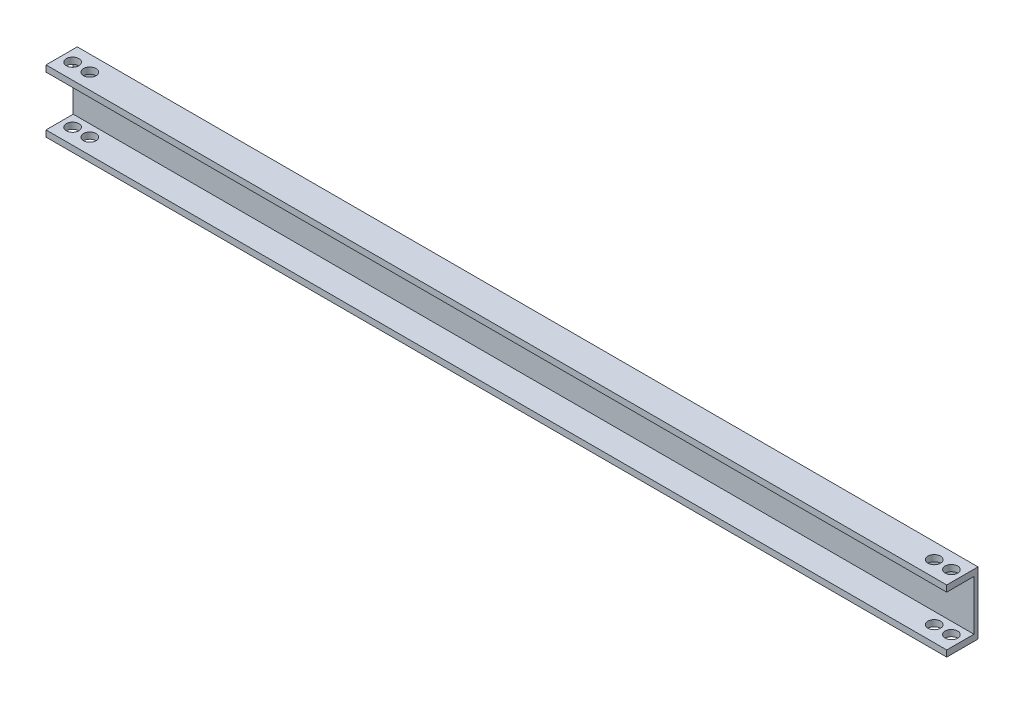
ISO-10303-21;
HEADER;
FILE_DESCRIPTION(('STEP AP214'),'2;1');
FILE_NAME('part.step','',(''),(''),'','','');
FILE_SCHEMA(('AUTOMOTIVE_DESIGN { 1 0 10303 214 1 1 1 1 }'));
ENDSEC;
DATA;
#1=APPLICATION_CONTEXT('core data for automotive mechanical design processes');
#2=APPLICATION_PROTOCOL_DEFINITION('international standard','automotive_design',2000,#1);
#3=PRODUCT_CONTEXT('',#1,'mechanical');
#4=PRODUCT('Part','Part','',(#3));
#5=PRODUCT_RELATED_PRODUCT_CATEGORY('part','',(#4));
#6=PRODUCT_DEFINITION_FORMATION('','',#4);
#7=PRODUCT_DEFINITION_CONTEXT('part definition',#1,'design');
#8=PRODUCT_DEFINITION('design','',#6,#7);
#9=PRODUCT_DEFINITION_SHAPE('','',#8);
#10=(LENGTH_UNIT() NAMED_UNIT(*) SI_UNIT(.MILLI.,.METRE.));
#11=(NAMED_UNIT(*) PLANE_ANGLE_UNIT() SI_UNIT($,.RADIAN.));
#12=(NAMED_UNIT(*) SI_UNIT($,.STERADIAN.) SOLID_ANGLE_UNIT());
#13=UNCERTAINTY_MEASURE_WITH_UNIT(LENGTH_MEASURE(1.E-05),#10,'distance_accuracy_value','');
#14=(GEOMETRIC_REPRESENTATION_CONTEXT(3) GLOBAL_UNCERTAINTY_ASSIGNED_CONTEXT((#13)) GLOBAL_UNIT_ASSIGNED_CONTEXT((#10,
#11,#12)) REPRESENTATION_CONTEXT('',''));
#15=CARTESIAN_POINT('',(0.,0.,0.));
#16=DIRECTION('',(0.,0.,1.));
#17=DIRECTION('',(1.,0.,0.));
#18=AXIS2_PLACEMENT_3D('',#15,#16,#17);
#19=CARTESIAN_POINT('',(0.,50.8,0.));
#20=DIRECTION('',(0.,0.,-1.));
#21=DIRECTION('',(-1.,0.,0.));
#22=AXIS2_PLACEMENT_3D('',#19,#20,#21);
#23=PLANE('',#22);
#24=DIRECTION('',(0.,-1.,0.));
#25=VECTOR('',#24,1.);
#26=CARTESIAN_POINT('',(0.,50.8,0.));
#27=LINE('',#26,#25);
#28=CARTESIAN_POINT('',(0.,50.8,0.));
#29=VERTEX_POINT('',#28);
#30=CARTESIAN_POINT('',(0.,45.72,0.));
#31=VERTEX_POINT('',#30);
#32=EDGE_CURVE('E11',#29,#31,#27,.T.);
#33=ORIENTED_EDGE('',*,*,#32,.T.);
#34=DIRECTION('',(-1.,0.,0.));
#35=VECTOR('',#34,1.);
#36=CARTESIAN_POINT('',(0.,45.72,0.));
#37=LINE('',#36,#35);
#38=CARTESIAN_POINT('',(731.52,45.72,0.));
#39=VERTEX_POINT('',#38);
#40=EDGE_CURVE('E126',#39,#31,#37,.T.);
#41=ORIENTED_EDGE('',*,*,#40,.F.);
#42=DIRECTION('',(0.,-1.,0.));
#43=VECTOR('',#42,1.);
#44=CARTESIAN_POINT('',(731.52,50.8,0.));
#45=LINE('',#44,#43);
#46=CARTESIAN_POINT('',(731.52,50.8,0.));
#47=VERTEX_POINT('',#46);
#48=EDGE_CURVE('E189',#47,#39,#45,.T.);
#49=ORIENTED_EDGE('',*,*,#48,.F.);
#50=DIRECTION('',(1.,0.,0.));
#51=VECTOR('',#50,1.);
#52=CARTESIAN_POINT('',(0.,50.8,0.));
#53=LINE('',#52,#51);
#54=EDGE_CURVE('E88',#29,#47,#53,.T.);
#55=ORIENTED_EDGE('',*,*,#54,.F.);
#56=EDGE_LOOP('',(#33,#41,#49,#55));
#57=FACE_BOUND('',#56,.T.);
#58=ADVANCED_FACE('F34',(#57),#23,.F.);
#59=CARTESIAN_POINT('',(8.89,-2.54,-12.7));
#60=DIRECTION('',(0.,1.,0.));
#61=DIRECTION('',(0.,0.,1.));
#62=AXIS2_PLACEMENT_3D('',#59,#60,#61);
#63=CYLINDRICAL_SURFACE('',#62,5.08);
#64=CARTESIAN_POINT('',(8.89,45.72,-12.7));
#65=DIRECTION('',(0.,1.,0.));
#66=DIRECTION('',(0.,0.,1.));
#67=AXIS2_PLACEMENT_3D('',#64,#65,#66);
#68=CIRCLE('',#67,5.08);
#69=CARTESIAN_POINT('',(8.89,45.72,-7.62));
#70=VERTEX_POINT('',#69);
#71=EDGE_CURVE('E152',#70,#70,#68,.F.);
#72=ORIENTED_EDGE('',*,*,#71,.T.);
#73=EDGE_LOOP('',(#72));
#74=FACE_BOUND('',#73,.T.);
#75=CARTESIAN_POINT('',(8.89,50.8,-12.7));
#76=DIRECTION('',(0.,1.,0.));
#77=DIRECTION('',(0.,0.,1.));
#78=AXIS2_PLACEMENT_3D('',#75,#76,#77);
#79=CIRCLE('',#78,5.08);
#80=CARTESIAN_POINT('',(8.89,50.8,-7.62));
#81=VERTEX_POINT('',#80);
#82=EDGE_CURVE('E165',#81,#81,#79,.T.);
#83=ORIENTED_EDGE('',*,*,#82,.T.);
#84=EDGE_LOOP('',(#83));
#85=FACE_BOUND('',#84,.T.);
#86=ADVANCED_FACE('F237',(#74,#85),#63,.F.);
#87=CARTESIAN_POINT('',(708.66,-2.54,-12.7));
#88=DIRECTION('',(0.,1.,0.));
#89=DIRECTION('',(0.,0.,1.));
#90=AXIS2_PLACEMENT_3D('',#87,#88,#89);
#91=CYLINDRICAL_SURFACE('',#90,5.08000000000002);
#92=CARTESIAN_POINT('',(708.66,45.72,-12.7));
#93=DIRECTION('',(0.,1.,0.));
#94=DIRECTION('',(0.,0.,1.));
#95=AXIS2_PLACEMENT_3D('',#92,#93,#94);
#96=CIRCLE('',#95,5.08000000000002);
#97=CARTESIAN_POINT('',(708.66,45.72,-7.61999999999998));
#98=VERTEX_POINT('',#97);
#99=EDGE_CURVE('E149',#98,#98,#96,.F.);
#100=ORIENTED_EDGE('',*,*,#99,.T.);
#101=EDGE_LOOP('',(#100));
#102=FACE_BOUND('',#101,.T.);
#103=CARTESIAN_POINT('',(708.66,50.8,-12.7));
#104=DIRECTION('',(0.,1.,0.));
#105=DIRECTION('',(0.,0.,1.));
#106=AXIS2_PLACEMENT_3D('',#103,#104,#105);
#107=CIRCLE('',#106,5.08000000000002);
#108=CARTESIAN_POINT('',(708.66,50.8,-7.61999999999998));
#109=VERTEX_POINT('',#108);
#110=EDGE_CURVE('E155',#109,#109,#107,.T.);
#111=ORIENTED_EDGE('',*,*,#110,.T.);
#112=EDGE_LOOP('',(#111));
#113=FACE_BOUND('',#112,.T.);
#114=ADVANCED_FACE('F241',(#102,#113),#91,.F.);
#115=CARTESIAN_POINT('',(722.63,-2.54,-12.7));
#116=DIRECTION('',(0.,1.,0.));
#117=DIRECTION('',(0.,0.,1.));
#118=AXIS2_PLACEMENT_3D('',#115,#116,#117);
#119=CYLINDRICAL_SURFACE('',#118,5.08000000000002);
#120=CARTESIAN_POINT('',(722.63,45.72,-12.7));
#121=DIRECTION('',(0.,1.,0.));
#122=DIRECTION('',(0.,0.,1.));
#123=AXIS2_PLACEMENT_3D('',#120,#121,#122);
#124=CIRCLE('',#123,5.08000000000002);
#125=CARTESIAN_POINT('',(722.63,45.72,-7.61999999999998));
#126=VERTEX_POINT('',#125);
#127=EDGE_CURVE('E146',#126,#126,#124,.F.);
#128=ORIENTED_EDGE('',*,*,#127,.T.);
#129=EDGE_LOOP('',(#128));
#130=FACE_BOUND('',#129,.T.);
#131=CARTESIAN_POINT('',(722.63,50.8,-12.7));
#132=DIRECTION('',(0.,1.,0.));
#133=DIRECTION('',(0.,0.,1.));
#134=AXIS2_PLACEMENT_3D('',#131,#132,#133);
#135=CIRCLE('',#134,5.08000000000002);
#136=CARTESIAN_POINT('',(722.63,50.8,-7.61999999999998));
#137=VERTEX_POINT('',#136);
#138=EDGE_CURVE('E160',#137,#137,#135,.T.);
#139=ORIENTED_EDGE('',*,*,#138,.T.);
#140=EDGE_LOOP('',(#139));
#141=FACE_BOUND('',#140,.T.);
#142=ADVANCED_FACE('F272',(#130,#141),#119,.F.);
#143=CARTESIAN_POINT('',(22.86,-2.54,-12.7));
#144=DIRECTION('',(0.,1.,0.));
#145=DIRECTION('',(0.,0.,1.));
#146=AXIS2_PLACEMENT_3D('',#143,#144,#145);
#147=CYLINDRICAL_SURFACE('',#146,5.08);
#148=CARTESIAN_POINT('',(22.86,45.72,-12.7));
#149=DIRECTION('',(0.,1.,0.));
#150=DIRECTION('',(0.,0.,1.));
#151=AXIS2_PLACEMENT_3D('',#148,#149,#150);
#152=CIRCLE('',#151,5.08);
#153=CARTESIAN_POINT('',(22.86,45.72,-7.62));
#154=VERTEX_POINT('',#153);
#155=EDGE_CURVE('E38',#154,#154,#152,.F.);
#156=ORIENTED_EDGE('',*,*,#155,.T.);
#157=EDGE_LOOP('',(#156));
#158=FACE_BOUND('',#157,.T.);
#159=CARTESIAN_POINT('',(22.86,50.8,-12.7));
#160=DIRECTION('',(0.,1.,0.));
#161=DIRECTION('',(0.,0.,1.));
#162=AXIS2_PLACEMENT_3D('',#159,#160,#161);
#163=CIRCLE('',#162,5.08);
#164=CARTESIAN_POINT('',(22.86,50.8,-7.62));
#165=VERTEX_POINT('',#164);
#166=EDGE_CURVE('E156',#165,#165,#163,.T.);
#167=ORIENTED_EDGE('',*,*,#166,.T.);
#168=EDGE_LOOP('',(#167));
#169=FACE_BOUND('',#168,.T.);
#170=ADVANCED_FACE('F250',(#158,#169),#147,.F.);
#171=CARTESIAN_POINT('',(0.,50.8,0.));
#172=DIRECTION('',(1.,0.,0.));
#173=DIRECTION('',(0.,0.,-1.));
#174=AXIS2_PLACEMENT_3D('',#171,#172,#173);
#175=PLANE('',#174);
#176=DIRECTION('',(0.,-1.,0.));
#177=VECTOR('',#176,1.);
#178=CARTESIAN_POINT('',(0.,5.08,-22.098));
#179=LINE('',#178,#177);
#180=CARTESIAN_POINT('',(0.,45.72,-22.098));
#181=VERTEX_POINT('',#180);
#182=CARTESIAN_POINT('',(0.,5.08,-22.098));
#183=VERTEX_POINT('',#182);
#184=EDGE_CURVE('E117',#181,#183,#179,.T.);
#185=ORIENTED_EDGE('',*,*,#184,.F.);
#186=DIRECTION('',(0.,0.,1.));
#187=VECTOR('',#186,1.);
#188=CARTESIAN_POINT('',(0.,45.72,-22.098));
#189=LINE('',#188,#187);
#190=EDGE_CURVE('E201',#181,#31,#189,.T.);
#191=ORIENTED_EDGE('',*,*,#190,.T.);
#192=ORIENTED_EDGE('',*,*,#32,.F.);
#193=DIRECTION('',(0.,0.,1.));
#194=VECTOR('',#193,1.);
#195=CARTESIAN_POINT('',(0.,50.8,0.));
#196=LINE('',#195,#194);
#197=CARTESIAN_POINT('',(0.,50.8,-25.4));
#198=VERTEX_POINT('',#197);
#199=EDGE_CURVE('E170',#198,#29,#196,.T.);
#200=ORIENTED_EDGE('',*,*,#199,.F.);
#201=DIRECTION('',(0.,-1.,0.));
#202=VECTOR('',#201,1.);
#203=CARTESIAN_POINT('',(0.,50.8,-25.4));
#204=LINE('',#203,#202);
#205=CARTESIAN_POINT('',(0.,0.,-25.4));
#206=VERTEX_POINT('',#205);
#207=EDGE_CURVE('E176',#198,#206,#204,.T.);
#208=ORIENTED_EDGE('',*,*,#207,.T.);
#209=DIRECTION('',(0.,0.,1.));
#210=VECTOR('',#209,1.);
#211=CARTESIAN_POINT('',(0.,0.,0.));
#212=LINE('',#211,#210);
#213=CARTESIAN_POINT('',(0.,0.,0.));
#214=VERTEX_POINT('',#213);
#215=EDGE_CURVE('E177',#206,#214,#212,.T.);
#216=ORIENTED_EDGE('',*,*,#215,.T.);
#217=CARTESIAN_POINT('',(0.,5.08,0.));
#218=VERTEX_POINT('',#217);
#219=EDGE_CURVE('E43',#218,#214,#27,.T.);
#220=ORIENTED_EDGE('',*,*,#219,.F.);
#221=DIRECTION('',(0.,0.,1.));
#222=VECTOR('',#221,1.);
#223=CARTESIAN_POINT('',(0.,5.08,-22.098));
#224=LINE('',#223,#222);
#225=EDGE_CURVE('E111',#183,#218,#224,.T.);
#226=ORIENTED_EDGE('',*,*,#225,.F.);
#227=EDGE_LOOP('',(#185,#191,#192,#200,#208,#216,#220,#226));
#228=FACE_BOUND('',#227,.T.);
#229=ADVANCED_FACE('F36',(#228),#175,.F.);
#230=CARTESIAN_POINT('',(731.52,5.08,0.));
#231=VERTEX_POINT('',#230);
#232=CARTESIAN_POINT('',(731.52,0.,0.));
#233=VERTEX_POINT('',#232);
#234=EDGE_CURVE('E188',#231,#233,#45,.T.);
#235=ORIENTED_EDGE('',*,*,#234,.F.);
#236=DIRECTION('',(1.,0.,0.));
#237=VECTOR('',#236,1.);
#238=CARTESIAN_POINT('',(0.,5.08,0.));
#239=LINE('',#238,#237);
#240=EDGE_CURVE('E208',#218,#231,#239,.T.);
#241=ORIENTED_EDGE('',*,*,#240,.F.);
#242=ORIENTED_EDGE('',*,*,#219,.T.);
#243=DIRECTION('',(1.,0.,0.));
#244=VECTOR('',#243,1.);
#245=CARTESIAN_POINT('',(0.,0.,0.));
#246=LINE('',#245,#244);
#247=EDGE_CURVE('E179',#214,#233,#246,.T.);
#248=ORIENTED_EDGE('',*,*,#247,.T.);
#249=EDGE_LOOP('',(#235,#241,#242,#248));
#250=FACE_BOUND('',#249,.T.);
#251=ADVANCED_FACE('F233',(#250),#23,.F.);
#252=CARTESIAN_POINT('',(731.52,50.8,0.));
#253=DIRECTION('',(-1.,0.,0.));
#254=DIRECTION('',(0.,0.,1.));
#255=AXIS2_PLACEMENT_3D('',#252,#253,#254);
#256=PLANE('',#255);
#257=ORIENTED_EDGE('',*,*,#48,.T.);
#258=DIRECTION('',(0.,0.,1.));
#259=VECTOR('',#258,1.);
#260=CARTESIAN_POINT('',(731.52,45.72,-22.098));
#261=LINE('',#260,#259);
#262=CARTESIAN_POINT('',(731.52,45.72,-22.098));
#263=VERTEX_POINT('',#262);
#264=EDGE_CURVE('E131',#263,#39,#261,.T.);
#265=ORIENTED_EDGE('',*,*,#264,.F.);
#266=DIRECTION('',(0.,1.,0.));
#267=VECTOR('',#266,1.);
#268=CARTESIAN_POINT('',(731.52,5.08,-22.098));
#269=LINE('',#268,#267);
#270=CARTESIAN_POINT('',(731.52,5.08,-22.098));
#271=VERTEX_POINT('',#270);
#272=EDGE_CURVE('E116',#271,#263,#269,.T.);
#273=ORIENTED_EDGE('',*,*,#272,.F.);
#274=DIRECTION('',(0.,0.,1.));
#275=VECTOR('',#274,1.);
#276=CARTESIAN_POINT('',(731.52,5.08,-22.098));
#277=LINE('',#276,#275);
#278=EDGE_CURVE('E114',#271,#231,#277,.T.);
#279=ORIENTED_EDGE('',*,*,#278,.T.);
#280=ORIENTED_EDGE('',*,*,#234,.T.);
#281=DIRECTION('',(0.,0.,-1.));
#282=VECTOR('',#281,1.);
#283=CARTESIAN_POINT('',(731.52,0.,0.));
#284=LINE('',#283,#282);
#285=CARTESIAN_POINT('',(731.52,0.,-25.4));
#286=VERTEX_POINT('',#285);
#287=EDGE_CURVE('E182',#233,#286,#284,.T.);
#288=ORIENTED_EDGE('',*,*,#287,.T.);
#289=DIRECTION('',(0.,-1.,0.));
#290=VECTOR('',#289,1.);
#291=CARTESIAN_POINT('',(731.52,50.8,-25.4));
#292=LINE('',#291,#290);
#293=CARTESIAN_POINT('',(731.52,50.8,-25.4));
#294=VERTEX_POINT('',#293);
#295=EDGE_CURVE('E186',#294,#286,#292,.T.);
#296=ORIENTED_EDGE('',*,*,#295,.F.);
#297=DIRECTION('',(0.,0.,-1.));
#298=VECTOR('',#297,1.);
#299=CARTESIAN_POINT('',(731.52,50.8,0.));
#300=LINE('',#299,#298);
#301=EDGE_CURVE('E173',#47,#294,#300,.T.);
#302=ORIENTED_EDGE('',*,*,#301,.F.);
#303=EDGE_LOOP('',(#257,#265,#273,#279,#280,#288,#296,#302));
#304=FACE_BOUND('',#303,.T.);
#305=ADVANCED_FACE('F216',(#304),#256,.F.);
#306=CARTESIAN_POINT('',(0.,50.8,-25.4));
#307=DIRECTION('',(0.,0.,1.));
#308=DIRECTION('',(1.,0.,0.));
#309=AXIS2_PLACEMENT_3D('',#306,#307,#308);
#310=PLANE('',#309);
#311=DIRECTION('',(-1.,0.,0.));
#312=VECTOR('',#311,1.);
#313=CARTESIAN_POINT('',(0.,0.,-25.4));
#314=LINE('',#313,#312);
#315=EDGE_CURVE('E81',#286,#206,#314,.T.);
#316=ORIENTED_EDGE('',*,*,#315,.T.);
#317=ORIENTED_EDGE('',*,*,#207,.F.);
#318=DIRECTION('',(-1.,0.,0.));
#319=VECTOR('',#318,1.);
#320=CARTESIAN_POINT('',(0.,50.8,-25.4));
#321=LINE('',#320,#319);
#322=EDGE_CURVE('E60',#294,#198,#321,.T.);
#323=ORIENTED_EDGE('',*,*,#322,.F.);
#324=ORIENTED_EDGE('',*,*,#295,.T.);
#325=EDGE_LOOP('',(#316,#317,#323,#324));
#326=FACE_BOUND('',#325,.T.);
#327=ADVANCED_FACE('F223',(#326),#310,.F.);
#328=CARTESIAN_POINT('',(0.,50.8,0.));
#329=DIRECTION('',(0.,-1.,0.));
#330=DIRECTION('',(0.,0.,-1.));
#331=AXIS2_PLACEMENT_3D('',#328,#329,#330);
#332=PLANE('',#331);
#333=ORIENTED_EDGE('',*,*,#166,.F.);
#334=EDGE_LOOP('',(#333));
#335=FACE_BOUND('',#334,.T.);
#336=ORIENTED_EDGE('',*,*,#138,.F.);
#337=EDGE_LOOP('',(#336));
#338=FACE_BOUND('',#337,.T.);
#339=ORIENTED_EDGE('',*,*,#110,.F.);
#340=EDGE_LOOP('',(#339));
#341=FACE_BOUND('',#340,.T.);
#342=ORIENTED_EDGE('',*,*,#82,.F.);
#343=EDGE_LOOP('',(#342));
#344=FACE_BOUND('',#343,.T.);
#345=ORIENTED_EDGE('',*,*,#199,.T.);
#346=ORIENTED_EDGE('',*,*,#54,.T.);
#347=ORIENTED_EDGE('',*,*,#301,.T.);
#348=ORIENTED_EDGE('',*,*,#322,.T.);
#349=EDGE_LOOP('',(#345,#346,#347,#348));
#350=FACE_BOUND('',#349,.T.);
#351=ADVANCED_FACE('F221',(#335,#338,#341,#344,#350),#332,.F.);
#352=CARTESIAN_POINT('',(0.,0.,0.));
#353=DIRECTION('',(0.,-1.,0.));
#354=DIRECTION('',(0.,0.,-1.));
#355=AXIS2_PLACEMENT_3D('',#352,#353,#354);
#356=PLANE('',#355);
#357=CARTESIAN_POINT('',(22.86,0.,-12.7));
#358=DIRECTION('',(0.,-1.,0.));
#359=DIRECTION('',(0.,0.,-1.));
#360=AXIS2_PLACEMENT_3D('',#357,#358,#359);
#361=CIRCLE('',#360,5.08);
#362=CARTESIAN_POINT('',(22.86,0.,-17.78));
#363=VERTEX_POINT('',#362);
#364=EDGE_CURVE('E169',#363,#363,#361,.T.);
#365=ORIENTED_EDGE('',*,*,#364,.F.);
#366=EDGE_LOOP('',(#365));
#367=FACE_BOUND('',#366,.T.);
#368=CARTESIAN_POINT('',(722.63,0.,-12.7));
#369=DIRECTION('',(0.,-1.,0.));
#370=DIRECTION('',(0.,0.,-1.));
#371=AXIS2_PLACEMENT_3D('',#368,#369,#370);
#372=CIRCLE('',#371,5.08000000000002);
#373=CARTESIAN_POINT('',(722.63,0.,-17.78));
#374=VERTEX_POINT('',#373);
#375=EDGE_CURVE('E196',#374,#374,#372,.T.);
#376=ORIENTED_EDGE('',*,*,#375,.F.);
#377=EDGE_LOOP('',(#376));
#378=FACE_BOUND('',#377,.T.);
#379=CARTESIAN_POINT('',(708.66,0.,-12.7));
#380=DIRECTION('',(0.,-1.,0.));
#381=DIRECTION('',(0.,0.,-1.));
#382=AXIS2_PLACEMENT_3D('',#379,#380,#381);
#383=CIRCLE('',#382,5.08000000000002);
#384=CARTESIAN_POINT('',(708.66,0.,-17.78));
#385=VERTEX_POINT('',#384);
#386=EDGE_CURVE('E159',#385,#385,#383,.T.);
#387=ORIENTED_EDGE('',*,*,#386,.F.);
#388=EDGE_LOOP('',(#387));
#389=FACE_BOUND('',#388,.T.);
#390=CARTESIAN_POINT('',(8.89,0.,-12.7));
#391=DIRECTION('',(0.,-1.,0.));
#392=DIRECTION('',(0.,0.,-1.));
#393=AXIS2_PLACEMENT_3D('',#390,#391,#392);
#394=CIRCLE('',#393,5.08);
#395=CARTESIAN_POINT('',(8.89,0.,-17.78));
#396=VERTEX_POINT('',#395);
#397=EDGE_CURVE('E168',#396,#396,#394,.T.);
#398=ORIENTED_EDGE('',*,*,#397,.F.);
#399=EDGE_LOOP('',(#398));
#400=FACE_BOUND('',#399,.T.);
#401=ORIENTED_EDGE('',*,*,#215,.F.);
#402=ORIENTED_EDGE('',*,*,#315,.F.);
#403=ORIENTED_EDGE('',*,*,#287,.F.);
#404=ORIENTED_EDGE('',*,*,#247,.F.);
#405=EDGE_LOOP('',(#401,#402,#403,#404));
#406=FACE_BOUND('',#405,.T.);
#407=ADVANCED_FACE('F230',(#367,#378,#389,#400,#406),#356,.T.);
#408=CARTESIAN_POINT('',(8.89,5.08,-12.7));
#409=DIRECTION('',(0.,-1.,0.));
#410=DIRECTION('',(0.,0.,-1.));
#411=AXIS2_PLACEMENT_3D('',#408,#409,#410);
#412=CIRCLE('',#411,5.08);
#413=CARTESIAN_POINT('',(8.89,5.08,-17.78));
#414=VERTEX_POINT('',#413);
#415=EDGE_CURVE('E143',#414,#414,#412,.F.);
#416=ORIENTED_EDGE('',*,*,#415,.T.);
#417=EDGE_LOOP('',(#416));
#418=FACE_BOUND('',#417,.T.);
#419=ORIENTED_EDGE('',*,*,#397,.T.);
#420=EDGE_LOOP('',(#419));
#421=FACE_BOUND('',#420,.T.);
#422=ADVANCED_FACE('F244',(#418,#421),#63,.F.);
#423=CARTESIAN_POINT('',(708.66,5.08,-12.7));
#424=DIRECTION('',(0.,-1.,0.));
#425=DIRECTION('',(0.,0.,-1.));
#426=AXIS2_PLACEMENT_3D('',#423,#424,#425);
#427=CIRCLE('',#426,5.08000000000002);
#428=CARTESIAN_POINT('',(708.66,5.08,-17.78));
#429=VERTEX_POINT('',#428);
#430=EDGE_CURVE('E139',#429,#429,#427,.F.);
#431=ORIENTED_EDGE('',*,*,#430,.T.);
#432=EDGE_LOOP('',(#431));
#433=FACE_BOUND('',#432,.T.);
#434=ORIENTED_EDGE('',*,*,#386,.T.);
#435=EDGE_LOOP('',(#434));
#436=FACE_BOUND('',#435,.T.);
#437=ADVANCED_FACE('F259',(#433,#436),#91,.F.);
#438=CARTESIAN_POINT('',(722.63,5.08,-12.7));
#439=DIRECTION('',(0.,-1.,0.));
#440=DIRECTION('',(0.,0.,-1.));
#441=AXIS2_PLACEMENT_3D('',#438,#439,#440);
#442=CIRCLE('',#441,5.08000000000002);
#443=CARTESIAN_POINT('',(722.63,5.08,-17.78));
#444=VERTEX_POINT('',#443);
#445=EDGE_CURVE('E136',#444,#444,#442,.F.);
#446=ORIENTED_EDGE('',*,*,#445,.T.);
#447=EDGE_LOOP('',(#446));
#448=FACE_BOUND('',#447,.T.);
#449=ORIENTED_EDGE('',*,*,#375,.T.);
#450=EDGE_LOOP('',(#449));
#451=FACE_BOUND('',#450,.T.);
#452=ADVANCED_FACE('F266',(#448,#451),#119,.F.);
#453=CARTESIAN_POINT('',(22.86,5.08,-12.7));
#454=DIRECTION('',(0.,-1.,0.));
#455=DIRECTION('',(0.,0.,-1.));
#456=AXIS2_PLACEMENT_3D('',#453,#454,#455);
#457=CIRCLE('',#456,5.08);
#458=CARTESIAN_POINT('',(22.86,5.08,-17.78));
#459=VERTEX_POINT('',#458);
#460=EDGE_CURVE('E140',#459,#459,#457,.F.);
#461=ORIENTED_EDGE('',*,*,#460,.T.);
#462=EDGE_LOOP('',(#461));
#463=FACE_BOUND('',#462,.T.);
#464=ORIENTED_EDGE('',*,*,#364,.T.);
#465=EDGE_LOOP('',(#464));
#466=FACE_BOUND('',#465,.T.);
#467=ADVANCED_FACE('F270',(#463,#466),#147,.F.);
#468=CARTESIAN_POINT('',(0.,45.72,-22.098));
#469=DIRECTION('',(0.,1.,0.));
#470=DIRECTION('',(0.,0.,1.));
#471=AXIS2_PLACEMENT_3D('',#468,#469,#470);
#472=PLANE('',#471);
#473=ORIENTED_EDGE('',*,*,#99,.F.);
#474=EDGE_LOOP('',(#473));
#475=FACE_BOUND('',#474,.T.);
#476=ORIENTED_EDGE('',*,*,#155,.F.);
#477=EDGE_LOOP('',(#476));
#478=FACE_BOUND('',#477,.T.);
#479=ORIENTED_EDGE('',*,*,#40,.T.);
#480=ORIENTED_EDGE('',*,*,#190,.F.);
#481=DIRECTION('',(-1.,0.,0.));
#482=VECTOR('',#481,1.);
#483=CARTESIAN_POINT('',(0.,45.72,-22.098));
#484=LINE('',#483,#482);
#485=EDGE_CURVE('E123',#263,#181,#484,.T.);
#486=ORIENTED_EDGE('',*,*,#485,.F.);
#487=ORIENTED_EDGE('',*,*,#264,.T.);
#488=EDGE_LOOP('',(#479,#480,#486,#487));
#489=FACE_BOUND('',#488,.T.);
#490=ORIENTED_EDGE('',*,*,#127,.F.);
#491=EDGE_LOOP('',(#490));
#492=FACE_BOUND('',#491,.T.);
#493=ORIENTED_EDGE('',*,*,#71,.F.);
#494=EDGE_LOOP('',(#493));
#495=FACE_BOUND('',#494,.T.);
#496=ADVANCED_FACE('F213',(#475,#478,#489,#492,#495),#472,.F.);
#497=CARTESIAN_POINT('',(0.,5.08,-22.098));
#498=DIRECTION('',(0.,-1.,0.));
#499=DIRECTION('',(0.,0.,-1.));
#500=AXIS2_PLACEMENT_3D('',#497,#498,#499);
#501=PLANE('',#500);
#502=ORIENTED_EDGE('',*,*,#430,.F.);
#503=EDGE_LOOP('',(#502));
#504=FACE_BOUND('',#503,.T.);
#505=ORIENTED_EDGE('',*,*,#460,.F.);
#506=EDGE_LOOP('',(#505));
#507=FACE_BOUND('',#506,.T.);
#508=ORIENTED_EDGE('',*,*,#240,.T.);
#509=ORIENTED_EDGE('',*,*,#278,.F.);
#510=DIRECTION('',(1.,0.,0.));
#511=VECTOR('',#510,1.);
#512=CARTESIAN_POINT('',(0.,5.08,-22.098));
#513=LINE('',#512,#511);
#514=EDGE_CURVE('E51',#183,#271,#513,.T.);
#515=ORIENTED_EDGE('',*,*,#514,.F.);
#516=ORIENTED_EDGE('',*,*,#225,.T.);
#517=EDGE_LOOP('',(#508,#509,#515,#516));
#518=FACE_BOUND('',#517,.T.);
#519=ORIENTED_EDGE('',*,*,#445,.F.);
#520=EDGE_LOOP('',(#519));
#521=FACE_BOUND('',#520,.T.);
#522=ORIENTED_EDGE('',*,*,#415,.F.);
#523=EDGE_LOOP('',(#522));
#524=FACE_BOUND('',#523,.T.);
#525=ADVANCED_FACE('F108',(#504,#507,#518,#521,#524),#501,.F.);
#526=CARTESIAN_POINT('',(0.,0.,-22.098));
#527=DIRECTION('',(0.,0.,-1.));
#528=DIRECTION('',(-1.,0.,0.));
#529=AXIS2_PLACEMENT_3D('',#526,#527,#528);
#530=PLANE('',#529);
#531=ORIENTED_EDGE('',*,*,#184,.T.);
#532=ORIENTED_EDGE('',*,*,#514,.T.);
#533=ORIENTED_EDGE('',*,*,#272,.T.);
#534=ORIENTED_EDGE('',*,*,#485,.T.);
#535=EDGE_LOOP('',(#531,#532,#533,#534));
#536=FACE_BOUND('',#535,.T.);
#537=ADVANCED_FACE('F121',(#536),#530,.F.);
#538=CLOSED_SHELL('',(#58,#86,#114,#142,#170,#229,#251,#305,#327,#351,#407,#422,#437,#452,#467,
#496,#525,#537));
#539=MANIFOLD_SOLID_BREP('B2',#538);
#540=ADVANCED_BREP_SHAPE_REPRESENTATION('',(#18,#539),#14);
#541=SHAPE_DEFINITION_REPRESENTATION(#9,#540);
ENDSEC;
END-ISO-10303-21;
